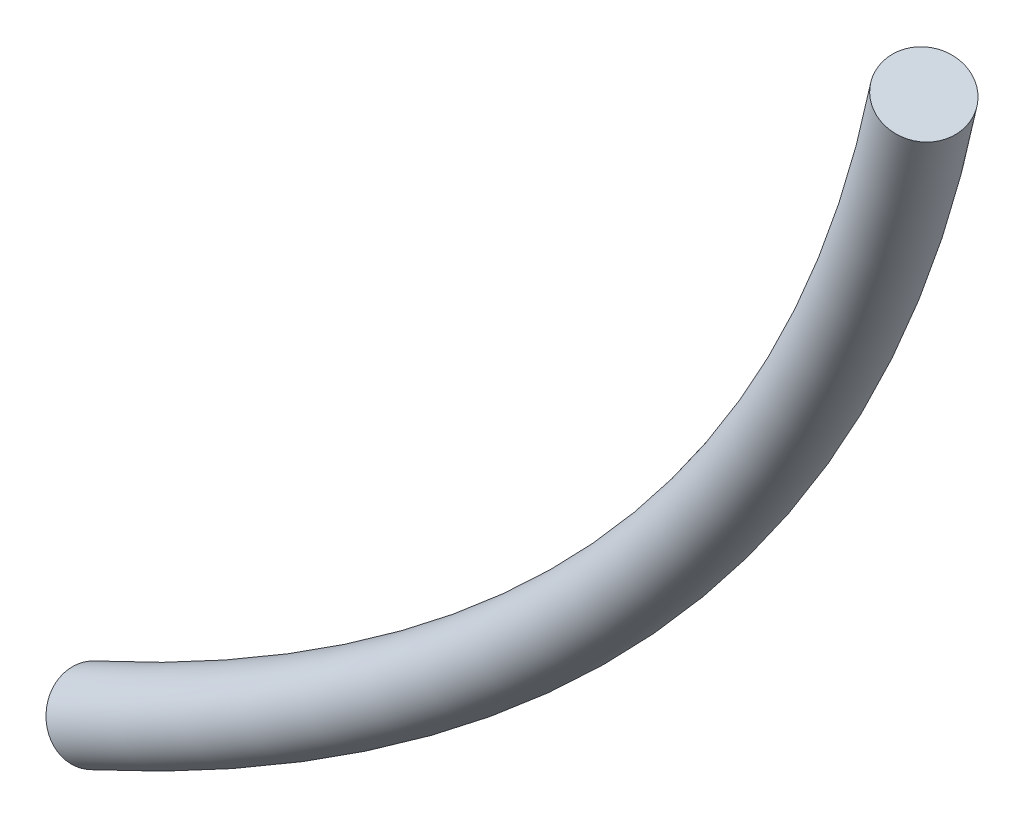
ISO-10303-21;
HEADER;
FILE_DESCRIPTION(('STEP AP214'),'2;1');
FILE_NAME('part.step','',(''),(''),'','','');
FILE_SCHEMA(('AUTOMOTIVE_DESIGN { 1 0 10303 214 1 1 1 1 }'));
ENDSEC;
DATA;
#1=APPLICATION_CONTEXT('core data for automotive mechanical design processes');
#2=APPLICATION_PROTOCOL_DEFINITION('international standard','automotive_design',2000,#1);
#3=PRODUCT_CONTEXT('',#1,'mechanical');
#4=PRODUCT('Part','Part','',(#3));
#5=PRODUCT_RELATED_PRODUCT_CATEGORY('part','',(#4));
#6=PRODUCT_DEFINITION_FORMATION('','',#4);
#7=PRODUCT_DEFINITION_CONTEXT('part definition',#1,'design');
#8=PRODUCT_DEFINITION('design','',#6,#7);
#9=PRODUCT_DEFINITION_SHAPE('','',#8);
#10=(LENGTH_UNIT() NAMED_UNIT(*) SI_UNIT(.MILLI.,.METRE.));
#11=(NAMED_UNIT(*) PLANE_ANGLE_UNIT() SI_UNIT($,.RADIAN.));
#12=(NAMED_UNIT(*) SI_UNIT($,.STERADIAN.) SOLID_ANGLE_UNIT());
#13=UNCERTAINTY_MEASURE_WITH_UNIT(LENGTH_MEASURE(1.E-05),#10,'distance_accuracy_value','');
#14=(GEOMETRIC_REPRESENTATION_CONTEXT(3) GLOBAL_UNCERTAINTY_ASSIGNED_CONTEXT((#13)) GLOBAL_UNIT_ASSIGNED_CONTEXT((#10,
#11,#12)) REPRESENTATION_CONTEXT('',''));
#15=CARTESIAN_POINT('',(0.,0.,0.));
#16=DIRECTION('',(0.,0.,1.));
#17=DIRECTION('',(1.,0.,0.));
#18=AXIS2_PLACEMENT_3D('',#15,#16,#17);
#19=CARTESIAN_POINT('',(3701.86468523823,-1049.43739363138,-16104.4255595974));
#20=DIRECTION('',(0.0199862904106645,0.248785410035061,-0.968352398638691));
#21=DIRECTION('',(0.,0.96854586165644,0.248835113816727));
#22=AXIS2_PLACEMENT_3D('',#19,#20,#21);
#23=TOROIDAL_SURFACE('',#22,3640.06072279726,50.7999999999761);
#24=CARTESIAN_POINT('',(7076.37596854863,-2386.49192943736,-16378.2883587192));
#25=DIRECTION('',(0.374409423198847,0.896205542275711,0.23797733046281));
#26=DIRECTION('',(-0.902444221564448,0.411164382847085,-0.128601233442424));
#27=AXIS2_PLACEMENT_3D('',#24,#25,#26);
#28=CIRCLE('',#27,50.7999999999761);
#29=CARTESIAN_POINT('',(7123.47001072174,-2405.15161002827,-16382.1103362231));
#30=VERTEX_POINT('',#29);
#31=EDGE_CURVE('E10',#30,#30,#28,.T.);
#32=CARTESIAN_POINT('',(5500.9376929723,-4123.04757588725,-16856.9538487847));
#33=DIRECTION('',(0.869094252093991,0.474469121522861,0.139836453396498));
#34=DIRECTION('',(-0.479177222675935,0.877718171891512,0.));
#35=AXIS2_PLACEMENT_3D('',#32,#33,#34);
#36=CIRCLE('',#35,50.7999999999761);
#37=CARTESIAN_POINT('',(5526.04521610247,-4165.94229912103,-16867.4559914691));
#38=VERTEX_POINT('',#37);
#39=EDGE_CURVE('E39',#38,#38,#36,.T.);
#40=CARTESIAN_POINT('',(3701.86468523823,-1049.43739363138,-16104.4255595974));
#41=DIRECTION('',(0.0199862904106645,0.248785410035061,-0.968352398638691));
#42=DIRECTION('',(0.,0.96854586165644,0.248835113816727));
#43=AXIS2_PLACEMENT_3D('',#40,#41,#42);
#44=CIRCLE('',#43,3690.86072279723);
#45=EDGE_CURVE('',#30,#38,#44,.T.);
#46=ORIENTED_EDGE('',*,*,#31,.F.);
#47=ORIENTED_EDGE('',*,*,#39,.T.);
#48=ORIENTED_EDGE('',*,*,#45,.T.);
#49=ORIENTED_EDGE('',*,*,#45,.F.);
#50=EDGE_LOOP('',(#46,#48,#47,#49));
#51=FACE_BOUND('',#50,.T.);
#52=ADVANCED_FACE('F33',(#51),#23,.T.);
#53=CARTESIAN_POINT('',(7076.37596854863,-2386.49192943736,-16378.2883587192));
#54=DIRECTION('',(0.374409423198847,0.896205542275711,0.23797733046281));
#55=DIRECTION('',(-0.902444221564448,0.411164382847085,-0.128601233442424));
#56=AXIS2_PLACEMENT_3D('',#53,#54,#55);
#57=PLANE('',#56);
#58=ORIENTED_EDGE('',*,*,#31,.T.);
#59=EDGE_LOOP('',(#58));
#60=FACE_BOUND('',#59,.T.);
#61=ADVANCED_FACE('F48',(#60),#57,.T.);
#62=CARTESIAN_POINT('',(5500.9376929723,-4123.04757588725,-16856.9538487847));
#63=DIRECTION('',(0.869094252093991,0.474469121522861,0.139836453396498));
#64=DIRECTION('',(-0.479177222675935,0.877718171891512,0.));
#65=AXIS2_PLACEMENT_3D('',#62,#63,#64);
#66=PLANE('',#65);
#67=ORIENTED_EDGE('',*,*,#39,.F.);
#68=EDGE_LOOP('',(#67));
#69=FACE_BOUND('',#68,.T.);
#70=ADVANCED_FACE('F46',(#69),#66,.F.);
#71=CLOSED_SHELL('',(#52,#61,#70));
#72=MANIFOLD_SOLID_BREP('B2',#71);
#73=ADVANCED_BREP_SHAPE_REPRESENTATION('',(#18,#72),#14);
#74=SHAPE_DEFINITION_REPRESENTATION(#9,#73);
ENDSEC;
END-ISO-10303-21;
